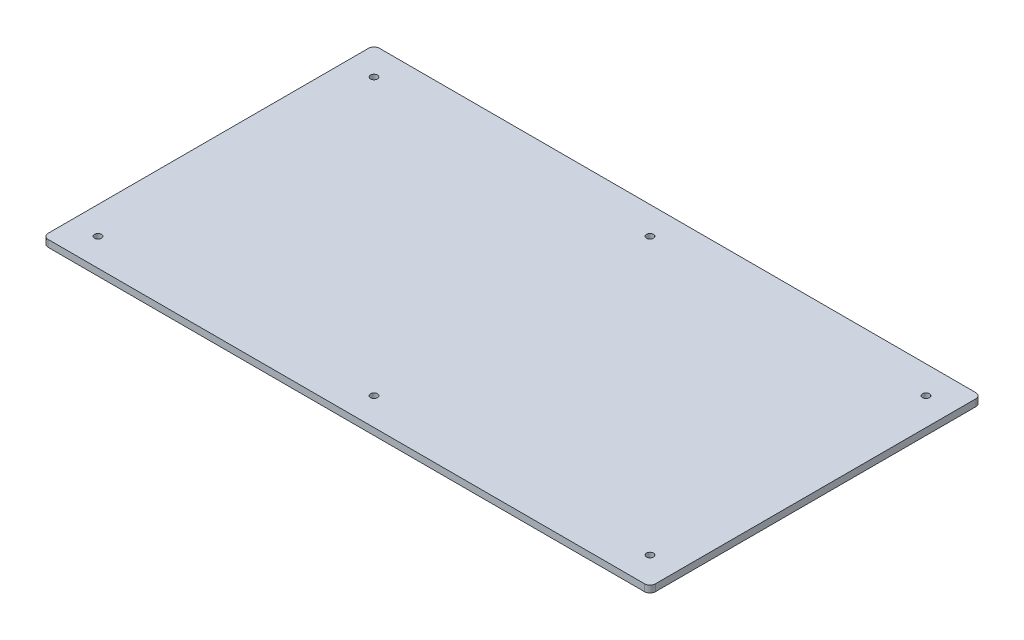
ISO-10303-21;
HEADER;
FILE_DESCRIPTION(('STEP AP214'),'2;1');
FILE_NAME('part.step','',(''),(''),'','','');
FILE_SCHEMA(('AUTOMOTIVE_DESIGN { 1 0 10303 214 1 1 1 1 }'));
ENDSEC;
DATA;
#1=APPLICATION_CONTEXT('core data for automotive mechanical design processes');
#2=APPLICATION_PROTOCOL_DEFINITION('international standard','automotive_design',2000,#1);
#3=PRODUCT_CONTEXT('',#1,'mechanical');
#4=PRODUCT('Part','Part','',(#3));
#5=PRODUCT_RELATED_PRODUCT_CATEGORY('part','',(#4));
#6=PRODUCT_DEFINITION_FORMATION('','',#4);
#7=PRODUCT_DEFINITION_CONTEXT('part definition',#1,'design');
#8=PRODUCT_DEFINITION('design','',#6,#7);
#9=PRODUCT_DEFINITION_SHAPE('','',#8);
#10=(LENGTH_UNIT() NAMED_UNIT(*) SI_UNIT(.MILLI.,.METRE.));
#11=(NAMED_UNIT(*) PLANE_ANGLE_UNIT() SI_UNIT($,.RADIAN.));
#12=(NAMED_UNIT(*) SI_UNIT($,.STERADIAN.) SOLID_ANGLE_UNIT());
#13=UNCERTAINTY_MEASURE_WITH_UNIT(LENGTH_MEASURE(1.E-05),#10,'distance_accuracy_value','');
#14=(GEOMETRIC_REPRESENTATION_CONTEXT(3) GLOBAL_UNCERTAINTY_ASSIGNED_CONTEXT((#13)) GLOBAL_UNIT_ASSIGNED_CONTEXT((#10,
#11,#12)) REPRESENTATION_CONTEXT('',''));
#15=CARTESIAN_POINT('',(0.,0.,0.));
#16=DIRECTION('',(0.,0.,1.));
#17=DIRECTION('',(1.,0.,0.));
#18=AXIS2_PLACEMENT_3D('',#15,#16,#17);
#19=CARTESIAN_POINT('',(1048.99674645883,12.7,228.951924021687));
#20=DIRECTION('',(-1.,0.,0.));
#21=DIRECTION('',(0.,0.,1.));
#22=AXIS2_PLACEMENT_3D('',#19,#20,#21);
#23=PLANE('',#22);
#24=DIRECTION('',(0.,0.,-1.));
#25=VECTOR('',#24,1.);
#26=CARTESIAN_POINT('',(1048.99674645883,12.7,228.951924021687));
#27=LINE('',#26,#25);
#28=CARTESIAN_POINT('',(1048.99674645883,12.7,218.951924021687));
#29=VERTEX_POINT('',#28);
#30=CARTESIAN_POINT('',(1048.99674645883,12.7,-370.648075978313));
#31=VERTEX_POINT('',#30);
#32=EDGE_CURVE('E135',#29,#31,#27,.T.);
#33=ORIENTED_EDGE('',*,*,#32,.F.);
#34=DIRECTION('',(0.,-1.,0.));
#35=VECTOR('',#34,1.);
#36=CARTESIAN_POINT('',(1048.99674645883,12.7,218.951924021687));
#37=LINE('',#36,#35);
#38=CARTESIAN_POINT('',(1048.99674645883,0.,218.951924021687));
#39=VERTEX_POINT('',#38);
#40=EDGE_CURVE('E11',#29,#39,#37,.T.);
#41=ORIENTED_EDGE('',*,*,#40,.T.);
#42=DIRECTION('',(0.,0.,-1.));
#43=VECTOR('',#42,1.);
#44=CARTESIAN_POINT('',(1048.99674645883,0.,228.951924021687));
#45=LINE('',#44,#43);
#46=CARTESIAN_POINT('',(1048.99674645883,0.,-370.648075978313));
#47=VERTEX_POINT('',#46);
#48=EDGE_CURVE('E166',#39,#47,#45,.T.);
#49=ORIENTED_EDGE('',*,*,#48,.T.);
#50=DIRECTION('',(0.,-1.,0.));
#51=VECTOR('',#50,1.);
#52=CARTESIAN_POINT('',(1048.99674645883,12.7,-370.648075978313));
#53=LINE('',#52,#51);
#54=EDGE_CURVE('E49',#47,#31,#53,.F.);
#55=ORIENTED_EDGE('',*,*,#54,.T.);
#56=EDGE_LOOP('',(#33,#41,#49,#55));
#57=FACE_BOUND('',#56,.T.);
#58=ADVANCED_FACE('F41',(#57),#23,.F.);
#59=CARTESIAN_POINT('',(1048.99674645883,12.7,-380.648075978313));
#60=DIRECTION('',(0.,0.,1.));
#61=DIRECTION('',(1.,0.,0.));
#62=AXIS2_PLACEMENT_3D('',#59,#60,#61);
#63=PLANE('',#62);
#64=DIRECTION('',(-1.,0.,0.));
#65=VECTOR('',#64,1.);
#66=CARTESIAN_POINT('',(1048.99674645883,0.,-380.648075978313));
#67=LINE('',#66,#65);
#68=CARTESIAN_POINT('',(1038.99674645883,0.,-380.648075978313));
#69=VERTEX_POINT('',#68);
#70=CARTESIAN_POINT('',(-58.6032535411707,0.,-380.648075978313));
#71=VERTEX_POINT('',#70);
#72=EDGE_CURVE('E140',#69,#71,#67,.T.);
#73=ORIENTED_EDGE('',*,*,#72,.T.);
#74=DIRECTION('',(0.,-1.,0.));
#75=VECTOR('',#74,1.);
#76=CARTESIAN_POINT('',(-58.6032535411707,12.7,-380.648075978313));
#77=LINE('',#76,#75);
#78=CARTESIAN_POINT('',(-58.6032535411707,12.7,-380.648075978313));
#79=VERTEX_POINT('',#78);
#80=EDGE_CURVE('E56',#71,#79,#77,.F.);
#81=ORIENTED_EDGE('',*,*,#80,.T.);
#82=DIRECTION('',(-1.,0.,0.));
#83=VECTOR('',#82,1.);
#84=CARTESIAN_POINT('',(1048.99674645883,12.7,-380.648075978313));
#85=LINE('',#84,#83);
#86=CARTESIAN_POINT('',(1038.99674645883,12.7,-380.648075978313));
#87=VERTEX_POINT('',#86);
#88=EDGE_CURVE('E138',#87,#79,#85,.T.);
#89=ORIENTED_EDGE('',*,*,#88,.F.);
#90=DIRECTION('',(0.,-1.,0.));
#91=VECTOR('',#90,1.);
#92=CARTESIAN_POINT('',(1038.99674645883,12.7,-380.648075978313));
#93=LINE('',#92,#91);
#94=EDGE_CURVE('E158',#87,#69,#93,.T.);
#95=ORIENTED_EDGE('',*,*,#94,.T.);
#96=EDGE_LOOP('',(#73,#81,#89,#95));
#97=FACE_BOUND('',#96,.T.);
#98=ADVANCED_FACE('F173',(#97),#63,.F.);
#99=CARTESIAN_POINT('',(-68.6032535411707,12.7,228.951924021687));
#100=DIRECTION('',(1.,0.,0.));
#101=DIRECTION('',(0.,0.,-1.));
#102=AXIS2_PLACEMENT_3D('',#99,#100,#101);
#103=PLANE('',#102);
#104=DIRECTION('',(0.,0.,1.));
#105=VECTOR('',#104,1.);
#106=CARTESIAN_POINT('',(-68.6032535411707,0.,228.951924021687));
#107=LINE('',#106,#105);
#108=CARTESIAN_POINT('',(-68.6032535411707,0.,-370.648075978313));
#109=VERTEX_POINT('',#108);
#110=CARTESIAN_POINT('',(-68.6032535411707,0.,218.951924021687));
#111=VERTEX_POINT('',#110);
#112=EDGE_CURVE('E136',#109,#111,#107,.T.);
#113=ORIENTED_EDGE('',*,*,#112,.T.);
#114=DIRECTION('',(0.,-1.,0.));
#115=VECTOR('',#114,1.);
#116=CARTESIAN_POINT('',(-68.6032535411707,12.7,218.951924021687));
#117=LINE('',#116,#115);
#118=CARTESIAN_POINT('',(-68.6032535411707,12.7,218.951924021687));
#119=VERTEX_POINT('',#118);
#120=EDGE_CURVE('E113',#111,#119,#117,.F.);
#121=ORIENTED_EDGE('',*,*,#120,.T.);
#122=DIRECTION('',(0.,0.,1.));
#123=VECTOR('',#122,1.);
#124=CARTESIAN_POINT('',(-68.6032535411707,12.7,228.951924021687));
#125=LINE('',#124,#123);
#126=CARTESIAN_POINT('',(-68.6032535411707,12.7,-370.648075978313));
#127=VERTEX_POINT('',#126);
#128=EDGE_CURVE('E178',#127,#119,#125,.T.);
#129=ORIENTED_EDGE('',*,*,#128,.F.);
#130=DIRECTION('',(0.,-1.,0.));
#131=VECTOR('',#130,1.);
#132=CARTESIAN_POINT('',(-68.6032535411707,12.7,-370.648075978313));
#133=LINE('',#132,#131);
#134=EDGE_CURVE('E118',#127,#109,#133,.T.);
#135=ORIENTED_EDGE('',*,*,#134,.T.);
#136=EDGE_LOOP('',(#113,#121,#129,#135));
#137=FACE_BOUND('',#136,.T.);
#138=ADVANCED_FACE('F259',(#137),#103,.F.);
#139=CARTESIAN_POINT('',(1048.99674645883,12.7,228.951924021687));
#140=DIRECTION('',(0.,0.,-1.));
#141=DIRECTION('',(-1.,0.,0.));
#142=AXIS2_PLACEMENT_3D('',#139,#140,#141);
#143=PLANE('',#142);
#144=DIRECTION('',(1.,0.,0.));
#145=VECTOR('',#144,1.);
#146=CARTESIAN_POINT('',(1048.99674645883,12.7,228.951924021687));
#147=LINE('',#146,#145);
#148=CARTESIAN_POINT('',(-58.6032535411707,12.7,228.951924021687));
#149=VERTEX_POINT('',#148);
#150=CARTESIAN_POINT('',(1038.99674645883,12.7,228.951924021687));
#151=VERTEX_POINT('',#150);
#152=EDGE_CURVE('E128',#149,#151,#147,.T.);
#153=ORIENTED_EDGE('',*,*,#152,.F.);
#154=DIRECTION('',(0.,-1.,0.));
#155=VECTOR('',#154,1.);
#156=CARTESIAN_POINT('',(-58.6032535411707,12.7,228.951924021687));
#157=LINE('',#156,#155);
#158=CARTESIAN_POINT('',(-58.6032535411707,0.,228.951924021687));
#159=VERTEX_POINT('',#158);
#160=EDGE_CURVE('E112',#149,#159,#157,.T.);
#161=ORIENTED_EDGE('',*,*,#160,.T.);
#162=DIRECTION('',(1.,0.,0.));
#163=VECTOR('',#162,1.);
#164=CARTESIAN_POINT('',(1048.99674645883,0.,228.951924021687));
#165=LINE('',#164,#163);
#166=CARTESIAN_POINT('',(1038.99674645883,0.,228.951924021687));
#167=VERTEX_POINT('',#166);
#168=EDGE_CURVE('E125',#159,#167,#165,.T.);
#169=ORIENTED_EDGE('',*,*,#168,.T.);
#170=DIRECTION('',(0.,-1.,0.));
#171=VECTOR('',#170,1.);
#172=CARTESIAN_POINT('',(1038.99674645883,12.7,228.951924021687));
#173=LINE('',#172,#171);
#174=EDGE_CURVE('E130',#167,#151,#173,.F.);
#175=ORIENTED_EDGE('',*,*,#174,.T.);
#176=EDGE_LOOP('',(#153,#161,#169,#175));
#177=FACE_BOUND('',#176,.T.);
#178=ADVANCED_FACE('F124',(#177),#143,.F.);
#179=CARTESIAN_POINT('',(0.,12.7,0.));
#180=DIRECTION('',(0.,1.,0.));
#181=DIRECTION('',(0.,0.,1.));
#182=AXIS2_PLACEMENT_3D('',#179,#180,#181);
#183=PLANE('',#182);
#184=CARTESIAN_POINT('',(490.196746458829,12.7,178.151924021687));
#185=DIRECTION('',(0.,1.,0.));
#186=DIRECTION('',(0.,0.,1.));
#187=AXIS2_PLACEMENT_3D('',#184,#185,#186);
#188=CIRCLE('',#187,6.34999999999999);
#189=CARTESIAN_POINT('',(490.196746458829,12.7,184.501924021687));
#190=VERTEX_POINT('',#189);
#191=EDGE_CURVE('E211',#190,#190,#188,.T.);
#192=ORIENTED_EDGE('',*,*,#191,.F.);
#193=EDGE_LOOP('',(#192));
#194=FACE_BOUND('',#193,.T.);
#195=CARTESIAN_POINT('',(490.196746458829,12.7,-329.848075978313));
#196=DIRECTION('',(0.,1.,0.));
#197=DIRECTION('',(0.,0.,1.));
#198=AXIS2_PLACEMENT_3D('',#195,#196,#197);
#199=CIRCLE('',#198,6.34999999999999);
#200=CARTESIAN_POINT('',(490.196746458829,12.7,-323.498075978313));
#201=VERTEX_POINT('',#200);
#202=EDGE_CURVE('E205',#201,#201,#199,.T.);
#203=ORIENTED_EDGE('',*,*,#202,.F.);
#204=EDGE_LOOP('',(#203));
#205=FACE_BOUND('',#204,.T.);
#206=CARTESIAN_POINT('',(998.196746458829,12.7,-329.848075978313));
#207=DIRECTION('',(0.,1.,0.));
#208=DIRECTION('',(0.,0.,1.));
#209=AXIS2_PLACEMENT_3D('',#206,#207,#208);
#210=CIRCLE('',#209,6.35000000000017);
#211=CARTESIAN_POINT('',(998.196746458829,12.7,-323.498075978313));
#212=VERTEX_POINT('',#211);
#213=EDGE_CURVE('E187',#212,#212,#210,.T.);
#214=ORIENTED_EDGE('',*,*,#213,.F.);
#215=EDGE_LOOP('',(#214));
#216=FACE_BOUND('',#215,.T.);
#217=CARTESIAN_POINT('',(-17.8032535411707,12.7,-329.848075978313));
#218=DIRECTION('',(0.,1.,0.));
#219=DIRECTION('',(0.,0.,1.));
#220=AXIS2_PLACEMENT_3D('',#217,#218,#219);
#221=CIRCLE('',#220,6.35);
#222=CARTESIAN_POINT('',(-17.8032535411707,12.7,-323.498075978313));
#223=VERTEX_POINT('',#222);
#224=EDGE_CURVE('E194',#223,#223,#221,.T.);
#225=ORIENTED_EDGE('',*,*,#224,.F.);
#226=EDGE_LOOP('',(#225));
#227=FACE_BOUND('',#226,.T.);
#228=CARTESIAN_POINT('',(-17.8032535411707,12.7,178.151924021687));
#229=DIRECTION('',(0.,1.,0.));
#230=DIRECTION('',(0.,0.,1.));
#231=AXIS2_PLACEMENT_3D('',#228,#229,#230);
#232=CIRCLE('',#231,6.35);
#233=CARTESIAN_POINT('',(-17.8032535411707,12.7,184.501924021687));
#234=VERTEX_POINT('',#233);
#235=EDGE_CURVE('E200',#234,#234,#232,.T.);
#236=ORIENTED_EDGE('',*,*,#235,.F.);
#237=EDGE_LOOP('',(#236));
#238=FACE_BOUND('',#237,.T.);
#239=CARTESIAN_POINT('',(998.196746458829,12.7,178.151924021687));
#240=DIRECTION('',(0.,1.,0.));
#241=DIRECTION('',(0.,0.,1.));
#242=AXIS2_PLACEMENT_3D('',#239,#240,#241);
#243=CIRCLE('',#242,6.35000000000016);
#244=CARTESIAN_POINT('',(998.196746458829,12.7,184.501924021687));
#245=VERTEX_POINT('',#244);
#246=EDGE_CURVE('E181',#245,#245,#243,.T.);
#247=ORIENTED_EDGE('',*,*,#246,.F.);
#248=EDGE_LOOP('',(#247));
#249=FACE_BOUND('',#248,.T.);
#250=ORIENTED_EDGE('',*,*,#128,.T.);
#251=CARTESIAN_POINT('',(-58.6032535411707,12.7,218.951924021687));
#252=DIRECTION('',(0.,1.,0.));
#253=DIRECTION('',(0.,0.,1.));
#254=AXIS2_PLACEMENT_3D('',#251,#252,#253);
#255=CIRCLE('',#254,10.);
#256=EDGE_CURVE('E156',#119,#149,#255,.T.);
#257=ORIENTED_EDGE('',*,*,#256,.T.);
#258=ORIENTED_EDGE('',*,*,#152,.T.);
#259=CARTESIAN_POINT('',(1038.99674645883,12.7,218.951924021687));
#260=DIRECTION('',(0.,1.,0.));
#261=DIRECTION('',(0.,0.,1.));
#262=AXIS2_PLACEMENT_3D('',#259,#260,#261);
#263=CIRCLE('',#262,10.);
#264=EDGE_CURVE('E152',#151,#29,#263,.T.);
#265=ORIENTED_EDGE('',*,*,#264,.T.);
#266=ORIENTED_EDGE('',*,*,#32,.T.);
#267=CARTESIAN_POINT('',(1038.99674645883,12.7,-370.648075978313));
#268=DIRECTION('',(0.,1.,0.));
#269=DIRECTION('',(0.,0.,1.));
#270=AXIS2_PLACEMENT_3D('',#267,#268,#269);
#271=CIRCLE('',#270,10.);
#272=EDGE_CURVE('E63',#31,#87,#271,.T.);
#273=ORIENTED_EDGE('',*,*,#272,.T.);
#274=ORIENTED_EDGE('',*,*,#88,.T.);
#275=CARTESIAN_POINT('',(-58.6032535411707,12.7,-370.648075978313));
#276=DIRECTION('',(0.,1.,0.));
#277=DIRECTION('',(0.,0.,1.));
#278=AXIS2_PLACEMENT_3D('',#275,#276,#277);
#279=CIRCLE('',#278,10.);
#280=EDGE_CURVE('E154',#79,#127,#279,.T.);
#281=ORIENTED_EDGE('',*,*,#280,.T.);
#282=EDGE_LOOP('',(#250,#257,#258,#265,#266,#273,#274,#281));
#283=FACE_BOUND('',#282,.T.);
#284=ADVANCED_FACE('F169',(#194,#205,#216,#227,#238,#249,#283),#183,.T.);
#285=CARTESIAN_POINT('',(0.,0.,0.));
#286=DIRECTION('',(0.,1.,0.));
#287=DIRECTION('',(0.,0.,1.));
#288=AXIS2_PLACEMENT_3D('',#285,#286,#287);
#289=PLANE('',#288);
#290=CARTESIAN_POINT('',(490.196746458829,0.,178.151924021687));
#291=DIRECTION('',(0.,1.,0.));
#292=DIRECTION('',(0.,0.,1.));
#293=AXIS2_PLACEMENT_3D('',#290,#291,#292);
#294=CIRCLE('',#293,6.34999999999999);
#295=CARTESIAN_POINT('',(490.196746458829,0.,184.501924021687));
#296=VERTEX_POINT('',#295);
#297=EDGE_CURVE('E191',#296,#296,#294,.T.);
#298=ORIENTED_EDGE('',*,*,#297,.T.);
#299=EDGE_LOOP('',(#298));
#300=FACE_BOUND('',#299,.T.);
#301=CARTESIAN_POINT('',(490.196746458829,0.,-329.848075978313));
#302=DIRECTION('',(0.,1.,0.));
#303=DIRECTION('',(0.,0.,1.));
#304=AXIS2_PLACEMENT_3D('',#301,#302,#303);
#305=CIRCLE('',#304,6.34999999999999);
#306=CARTESIAN_POINT('',(490.196746458829,0.,-323.498075978313));
#307=VERTEX_POINT('',#306);
#308=EDGE_CURVE('E208',#307,#307,#305,.T.);
#309=ORIENTED_EDGE('',*,*,#308,.T.);
#310=EDGE_LOOP('',(#309));
#311=FACE_BOUND('',#310,.T.);
#312=CARTESIAN_POINT('',(998.196746458829,0.,-329.848075978313));
#313=DIRECTION('',(0.,1.,0.));
#314=DIRECTION('',(0.,0.,1.));
#315=AXIS2_PLACEMENT_3D('',#312,#313,#314);
#316=CIRCLE('',#315,6.35000000000017);
#317=CARTESIAN_POINT('',(998.196746458829,0.,-323.498075978313));
#318=VERTEX_POINT('',#317);
#319=EDGE_CURVE('E190',#318,#318,#316,.T.);
#320=ORIENTED_EDGE('',*,*,#319,.T.);
#321=EDGE_LOOP('',(#320));
#322=FACE_BOUND('',#321,.T.);
#323=CARTESIAN_POINT('',(-17.8032535411707,0.,-329.848075978313));
#324=DIRECTION('',(0.,1.,0.));
#325=DIRECTION('',(0.,0.,1.));
#326=AXIS2_PLACEMENT_3D('',#323,#324,#325);
#327=CIRCLE('',#326,6.35);
#328=CARTESIAN_POINT('',(-17.8032535411707,0.,-323.498075978313));
#329=VERTEX_POINT('',#328);
#330=EDGE_CURVE('E197',#329,#329,#327,.T.);
#331=ORIENTED_EDGE('',*,*,#330,.T.);
#332=EDGE_LOOP('',(#331));
#333=FACE_BOUND('',#332,.T.);
#334=CARTESIAN_POINT('',(-17.8032535411707,0.,178.151924021687));
#335=DIRECTION('',(0.,1.,0.));
#336=DIRECTION('',(0.,0.,1.));
#337=AXIS2_PLACEMENT_3D('',#334,#335,#336);
#338=CIRCLE('',#337,6.35);
#339=CARTESIAN_POINT('',(-17.8032535411707,0.,184.501924021687));
#340=VERTEX_POINT('',#339);
#341=EDGE_CURVE('E184',#340,#340,#338,.T.);
#342=ORIENTED_EDGE('',*,*,#341,.T.);
#343=EDGE_LOOP('',(#342));
#344=FACE_BOUND('',#343,.T.);
#345=CARTESIAN_POINT('',(998.196746458829,0.,178.151924021687));
#346=DIRECTION('',(0.,1.,0.));
#347=DIRECTION('',(0.,0.,1.));
#348=AXIS2_PLACEMENT_3D('',#345,#346,#347);
#349=CIRCLE('',#348,6.35000000000016);
#350=CARTESIAN_POINT('',(998.196746458829,0.,184.501924021687));
#351=VERTEX_POINT('',#350);
#352=EDGE_CURVE('E174',#351,#351,#349,.T.);
#353=ORIENTED_EDGE('',*,*,#352,.T.);
#354=EDGE_LOOP('',(#353));
#355=FACE_BOUND('',#354,.T.);
#356=ORIENTED_EDGE('',*,*,#168,.F.);
#357=CARTESIAN_POINT('',(-58.6032535411707,0.,218.951924021687));
#358=DIRECTION('',(0.,1.,0.));
#359=DIRECTION('',(0.,0.,1.));
#360=AXIS2_PLACEMENT_3D('',#357,#358,#359);
#361=CIRCLE('',#360,10.);
#362=EDGE_CURVE('E108',#159,#111,#361,.F.);
#363=ORIENTED_EDGE('',*,*,#362,.T.);
#364=ORIENTED_EDGE('',*,*,#112,.F.);
#365=CARTESIAN_POINT('',(-58.6032535411707,0.,-370.648075978313));
#366=DIRECTION('',(0.,1.,0.));
#367=DIRECTION('',(0.,0.,1.));
#368=AXIS2_PLACEMENT_3D('',#365,#366,#367);
#369=CIRCLE('',#368,10.);
#370=EDGE_CURVE('E119',#109,#71,#369,.F.);
#371=ORIENTED_EDGE('',*,*,#370,.T.);
#372=ORIENTED_EDGE('',*,*,#72,.F.);
#373=CARTESIAN_POINT('',(1038.99674645883,0.,-370.648075978313));
#374=DIRECTION('',(0.,1.,0.));
#375=DIRECTION('',(0.,0.,1.));
#376=AXIS2_PLACEMENT_3D('',#373,#374,#375);
#377=CIRCLE('',#376,10.);
#378=EDGE_CURVE('E129',#69,#47,#377,.F.);
#379=ORIENTED_EDGE('',*,*,#378,.T.);
#380=ORIENTED_EDGE('',*,*,#48,.F.);
#381=CARTESIAN_POINT('',(1038.99674645883,0.,218.951924021687));
#382=DIRECTION('',(0.,1.,0.));
#383=DIRECTION('',(0.,0.,1.));
#384=AXIS2_PLACEMENT_3D('',#381,#382,#383);
#385=CIRCLE('',#384,10.);
#386=EDGE_CURVE('E134',#39,#167,#385,.F.);
#387=ORIENTED_EDGE('',*,*,#386,.T.);
#388=EDGE_LOOP('',(#356,#363,#364,#371,#372,#379,#380,#387));
#389=FACE_BOUND('',#388,.T.);
#390=ADVANCED_FACE('F132',(#300,#311,#322,#333,#344,#355,#389),#289,.F.);
#391=CARTESIAN_POINT('',(998.196746458829,0.,178.151924021687));
#392=DIRECTION('',(0.,1.,0.));
#393=DIRECTION('',(0.,0.,1.));
#394=AXIS2_PLACEMENT_3D('',#391,#392,#393);
#395=CYLINDRICAL_SURFACE('',#394,6.35000000000016);
#396=ORIENTED_EDGE('',*,*,#352,.F.);
#397=EDGE_LOOP('',(#396));
#398=FACE_BOUND('',#397,.T.);
#399=ORIENTED_EDGE('',*,*,#246,.T.);
#400=EDGE_LOOP('',(#399));
#401=FACE_BOUND('',#400,.T.);
#402=ADVANCED_FACE('F239',(#398,#401),#395,.F.);
#403=CARTESIAN_POINT('',(-17.8032535411707,0.,178.151924021687));
#404=DIRECTION('',(0.,1.,0.));
#405=DIRECTION('',(0.,0.,1.));
#406=AXIS2_PLACEMENT_3D('',#403,#404,#405);
#407=CYLINDRICAL_SURFACE('',#406,6.35);
#408=ORIENTED_EDGE('',*,*,#341,.F.);
#409=EDGE_LOOP('',(#408));
#410=FACE_BOUND('',#409,.T.);
#411=ORIENTED_EDGE('',*,*,#235,.T.);
#412=EDGE_LOOP('',(#411));
#413=FACE_BOUND('',#412,.T.);
#414=ADVANCED_FACE('F241',(#410,#413),#407,.F.);
#415=CARTESIAN_POINT('',(-17.8032535411707,0.,-329.848075978313));
#416=DIRECTION('',(0.,1.,0.));
#417=DIRECTION('',(0.,0.,1.));
#418=AXIS2_PLACEMENT_3D('',#415,#416,#417);
#419=CYLINDRICAL_SURFACE('',#418,6.35);
#420=ORIENTED_EDGE('',*,*,#330,.F.);
#421=EDGE_LOOP('',(#420));
#422=FACE_BOUND('',#421,.T.);
#423=ORIENTED_EDGE('',*,*,#224,.T.);
#424=EDGE_LOOP('',(#423));
#425=FACE_BOUND('',#424,.T.);
#426=ADVANCED_FACE('F248',(#422,#425),#419,.F.);
#427=CARTESIAN_POINT('',(998.196746458829,0.,-329.848075978313));
#428=DIRECTION('',(0.,1.,0.));
#429=DIRECTION('',(0.,0.,1.));
#430=AXIS2_PLACEMENT_3D('',#427,#428,#429);
#431=CYLINDRICAL_SURFACE('',#430,6.35000000000017);
#432=ORIENTED_EDGE('',*,*,#319,.F.);
#433=EDGE_LOOP('',(#432));
#434=FACE_BOUND('',#433,.T.);
#435=ORIENTED_EDGE('',*,*,#213,.T.);
#436=EDGE_LOOP('',(#435));
#437=FACE_BOUND('',#436,.T.);
#438=ADVANCED_FACE('F328',(#434,#437),#431,.F.);
#439=CARTESIAN_POINT('',(490.196746458829,0.,-329.848075978313));
#440=DIRECTION('',(0.,1.,0.));
#441=DIRECTION('',(0.,0.,1.));
#442=AXIS2_PLACEMENT_3D('',#439,#440,#441);
#443=CYLINDRICAL_SURFACE('',#442,6.34999999999999);
#444=ORIENTED_EDGE('',*,*,#308,.F.);
#445=EDGE_LOOP('',(#444));
#446=FACE_BOUND('',#445,.T.);
#447=ORIENTED_EDGE('',*,*,#202,.T.);
#448=EDGE_LOOP('',(#447));
#449=FACE_BOUND('',#448,.T.);
#450=ADVANCED_FACE('F222',(#446,#449),#443,.F.);
#451=CARTESIAN_POINT('',(490.196746458829,0.,178.151924021687));
#452=DIRECTION('',(0.,1.,0.));
#453=DIRECTION('',(0.,0.,1.));
#454=AXIS2_PLACEMENT_3D('',#451,#452,#453);
#455=CYLINDRICAL_SURFACE('',#454,6.34999999999999);
#456=ORIENTED_EDGE('',*,*,#297,.F.);
#457=EDGE_LOOP('',(#456));
#458=FACE_BOUND('',#457,.T.);
#459=ORIENTED_EDGE('',*,*,#191,.T.);
#460=EDGE_LOOP('',(#459));
#461=FACE_BOUND('',#460,.T.);
#462=ADVANCED_FACE('F219',(#458,#461),#455,.F.);
#463=CARTESIAN_POINT('',(-58.6032535411707,12.7,218.951924021687));
#464=DIRECTION('',(0.,-1.,0.));
#465=DIRECTION('',(0.,0.,-1.));
#466=AXIS2_PLACEMENT_3D('',#463,#464,#465);
#467=CYLINDRICAL_SURFACE('',#466,10.);
#468=ORIENTED_EDGE('',*,*,#256,.F.);
#469=ORIENTED_EDGE('',*,*,#120,.F.);
#470=ORIENTED_EDGE('',*,*,#362,.F.);
#471=ORIENTED_EDGE('',*,*,#160,.F.);
#472=EDGE_LOOP('',(#468,#469,#470,#471));
#473=FACE_BOUND('',#472,.T.);
#474=ADVANCED_FACE('F111',(#473),#467,.T.);
#475=CARTESIAN_POINT('',(-58.6032535411707,12.7,-370.648075978313));
#476=DIRECTION('',(0.,-1.,0.));
#477=DIRECTION('',(0.,0.,-1.));
#478=AXIS2_PLACEMENT_3D('',#475,#476,#477);
#479=CYLINDRICAL_SURFACE('',#478,10.);
#480=ORIENTED_EDGE('',*,*,#280,.F.);
#481=ORIENTED_EDGE('',*,*,#80,.F.);
#482=ORIENTED_EDGE('',*,*,#370,.F.);
#483=ORIENTED_EDGE('',*,*,#134,.F.);
#484=EDGE_LOOP('',(#480,#481,#482,#483));
#485=FACE_BOUND('',#484,.T.);
#486=ADVANCED_FACE('F265',(#485),#479,.T.);
#487=CARTESIAN_POINT('',(1038.99674645883,12.7,218.951924021687));
#488=DIRECTION('',(0.,-1.,0.));
#489=DIRECTION('',(0.,0.,-1.));
#490=AXIS2_PLACEMENT_3D('',#487,#488,#489);
#491=CYLINDRICAL_SURFACE('',#490,10.);
#492=ORIENTED_EDGE('',*,*,#264,.F.);
#493=ORIENTED_EDGE('',*,*,#174,.F.);
#494=ORIENTED_EDGE('',*,*,#386,.F.);
#495=ORIENTED_EDGE('',*,*,#40,.F.);
#496=EDGE_LOOP('',(#492,#493,#494,#495));
#497=FACE_BOUND('',#496,.T.);
#498=ADVANCED_FACE('F267',(#497),#491,.T.);
#499=CARTESIAN_POINT('',(1038.99674645883,12.7,-370.648075978313));
#500=DIRECTION('',(0.,-1.,0.));
#501=DIRECTION('',(0.,0.,-1.));
#502=AXIS2_PLACEMENT_3D('',#499,#500,#501);
#503=CYLINDRICAL_SURFACE('',#502,10.);
#504=ORIENTED_EDGE('',*,*,#272,.F.);
#505=ORIENTED_EDGE('',*,*,#54,.F.);
#506=ORIENTED_EDGE('',*,*,#378,.F.);
#507=ORIENTED_EDGE('',*,*,#94,.F.);
#508=EDGE_LOOP('',(#504,#505,#506,#507));
#509=FACE_BOUND('',#508,.T.);
#510=ADVANCED_FACE('F43',(#509),#503,.T.);
#511=CLOSED_SHELL('',(#58,#98,#138,#178,#284,#390,#402,#414,#426,#438,#450,#462,#474,#486,#498,#510));
#512=MANIFOLD_SOLID_BREP('B2',#511);
#513=ADVANCED_BREP_SHAPE_REPRESENTATION('',(#18,#512),#14);
#514=SHAPE_DEFINITION_REPRESENTATION(#9,#513);
ENDSEC;
END-ISO-10303-21;
